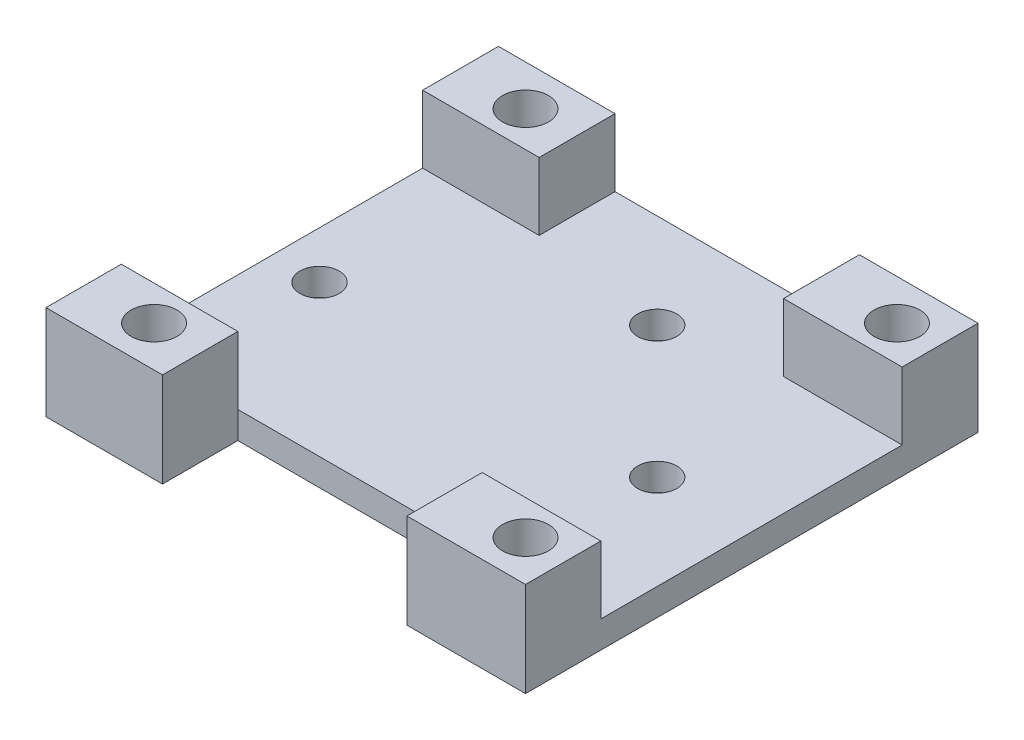
ISO-10303-21;
HEADER;
FILE_DESCRIPTION(('STEP AP214'),'2;1');
FILE_NAME('part.step','',(''),(''),'','','');
FILE_SCHEMA(('AUTOMOTIVE_DESIGN { 1 0 10303 214 1 1 1 1 }'));
ENDSEC;
DATA;
#1=APPLICATION_CONTEXT('core data for automotive mechanical design processes');
#2=APPLICATION_PROTOCOL_DEFINITION('international standard','automotive_design',2000,#1);
#3=PRODUCT_CONTEXT('',#1,'mechanical');
#4=PRODUCT('Part','Part','',(#3));
#5=PRODUCT_RELATED_PRODUCT_CATEGORY('part','',(#4));
#6=PRODUCT_DEFINITION_FORMATION('','',#4);
#7=PRODUCT_DEFINITION_CONTEXT('part definition',#1,'design');
#8=PRODUCT_DEFINITION('design','',#6,#7);
#9=PRODUCT_DEFINITION_SHAPE('','',#8);
#10=(LENGTH_UNIT() NAMED_UNIT(*) SI_UNIT(.MILLI.,.METRE.));
#11=(NAMED_UNIT(*) PLANE_ANGLE_UNIT() SI_UNIT($,.RADIAN.));
#12=(NAMED_UNIT(*) SI_UNIT($,.STERADIAN.) SOLID_ANGLE_UNIT());
#13=UNCERTAINTY_MEASURE_WITH_UNIT(LENGTH_MEASURE(1.E-05),#10,'distance_accuracy_value','');
#14=(GEOMETRIC_REPRESENTATION_CONTEXT(3) GLOBAL_UNCERTAINTY_ASSIGNED_CONTEXT((#13)) GLOBAL_UNIT_ASSIGNED_CONTEXT((#10,
#11,#12)) REPRESENTATION_CONTEXT('',''));
#15=CARTESIAN_POINT('',(0.,0.,0.));
#16=DIRECTION('',(0.,0.,1.));
#17=DIRECTION('',(1.,0.,0.));
#18=AXIS2_PLACEMENT_3D('',#15,#16,#17);
#19=CARTESIAN_POINT('',(0.,2.,0.));
#20=DIRECTION('',(0.,1.,0.));
#21=DIRECTION('',(0.,0.,1.));
#22=AXIS2_PLACEMENT_3D('',#19,#20,#21);
#23=PLANE('',#22);
#24=DIRECTION('',(0.,0.,-1.));
#25=VECTOR('',#24,1.);
#26=CARTESIAN_POINT('',(-15.5,2.,0.));
#27=LINE('',#26,#25);
#28=CARTESIAN_POINT('',(-15.5,2.,11.1762712747934));
#29=VERTEX_POINT('',#28);
#30=CARTESIAN_POINT('',(-15.5,2.,-11.1332856160443));
#31=VERTEX_POINT('',#30);
#32=EDGE_CURVE('E353',#29,#31,#27,.T.);
#33=ORIENTED_EDGE('',*,*,#32,.F.);
#34=DIRECTION('',(1.,0.,0.));
#35=VECTOR('',#34,1.);
#36=CARTESIAN_POINT('',(-20.,2.,11.1762712747934));
#37=LINE('',#36,#35);
#38=CARTESIAN_POINT('',(-6.87255590859099,2.,11.1762712747934));
#39=VERTEX_POINT('',#38);
#40=EDGE_CURVE('E207',#29,#39,#37,.T.);
#41=ORIENTED_EDGE('',*,*,#40,.T.);
#42=CARTESIAN_POINT('',(11.2192569335427,2.,11.1762712747934));
#43=VERTEX_POINT('',#42);
#44=EDGE_CURVE('E195',#39,#43,#37,.T.);
#45=ORIENTED_EDGE('',*,*,#44,.T.);
#46=CARTESIAN_POINT('',(20.,2.,11.1762712747934));
#47=VERTEX_POINT('',#46);
#48=EDGE_CURVE('E204',#43,#47,#37,.T.);
#49=ORIENTED_EDGE('',*,*,#48,.T.);
#50=DIRECTION('',(0.,0.,-1.));
#51=VECTOR('',#50,1.);
#52=CARTESIAN_POINT('',(20.,2.,-11.1332856160443));
#53=LINE('',#52,#51);
#54=CARTESIAN_POINT('',(20.,2.,-11.1332856160443));
#55=VERTEX_POINT('',#54);
#56=EDGE_CURVE('E259',#47,#55,#53,.T.);
#57=ORIENTED_EDGE('',*,*,#56,.T.);
#58=DIRECTION('',(-1.,0.,0.));
#59=VECTOR('',#58,1.);
#60=CARTESIAN_POINT('',(11.2192569335427,2.,-11.1332856160443));
#61=LINE('',#60,#59);
#62=CARTESIAN_POINT('',(11.2192569335427,2.,-11.1332856160443));
#63=VERTEX_POINT('',#62);
#64=EDGE_CURVE('E262',#55,#63,#61,.T.);
#65=ORIENTED_EDGE('',*,*,#64,.T.);
#66=DIRECTION('',(0.,0.,-1.));
#67=VECTOR('',#66,1.);
#68=CARTESIAN_POINT('',(11.2192569335427,2.,-16.75));
#69=LINE('',#68,#67);
#70=CARTESIAN_POINT('',(11.2192569335427,2.,-16.75));
#71=VERTEX_POINT('',#70);
#72=EDGE_CURVE('E209',#63,#71,#69,.T.);
#73=ORIENTED_EDGE('',*,*,#72,.T.);
#74=DIRECTION('',(-1.,0.,0.));
#75=VECTOR('',#74,1.);
#76=CARTESIAN_POINT('',(-20.,2.,-16.75));
#77=LINE('',#76,#75);
#78=CARTESIAN_POINT('',(-6.87255590859099,2.,-16.75));
#79=VERTEX_POINT('',#78);
#80=EDGE_CURVE('E216',#71,#79,#77,.T.);
#81=ORIENTED_EDGE('',*,*,#80,.T.);
#82=DIRECTION('',(0.,0.,-1.));
#83=VECTOR('',#82,1.);
#84=CARTESIAN_POINT('',(-6.87255590859099,2.,-16.75));
#85=LINE('',#84,#83);
#86=CARTESIAN_POINT('',(-6.87255590859099,2.,-11.1332856160443));
#87=VERTEX_POINT('',#86);
#88=EDGE_CURVE('E329',#87,#79,#85,.T.);
#89=ORIENTED_EDGE('',*,*,#88,.F.);
#90=DIRECTION('',(1.,0.,0.));
#91=VECTOR('',#90,1.);
#92=CARTESIAN_POINT('',(-6.87255590859099,2.,-11.1332856160443));
#93=LINE('',#92,#91);
#94=EDGE_CURVE('E326',#31,#87,#93,.T.);
#95=ORIENTED_EDGE('',*,*,#94,.F.);
#96=EDGE_LOOP('',(#33,#41,#45,#49,#57,#65,#73,#81,#89,#95));
#97=FACE_BOUND('',#96,.T.);
#98=CARTESIAN_POINT('',(3.25,2.,-9.75000000000001));
#99=DIRECTION('',(0.,1.,0.));
#100=DIRECTION('',(0.,0.,1.));
#101=AXIS2_PLACEMENT_3D('',#98,#99,#100);
#102=CIRCLE('',#101,1.44999999999999);
#103=CARTESIAN_POINT('',(3.25,2.,-8.30000000000002));
#104=VERTEX_POINT('',#103);
#105=EDGE_CURVE('E271',#104,#104,#102,.T.);
#106=ORIENTED_EDGE('',*,*,#105,.F.);
#107=EDGE_LOOP('',(#106));
#108=FACE_BOUND('',#107,.T.);
#109=CARTESIAN_POINT('',(13.,2.,0.));
#110=DIRECTION('',(0.,1.,0.));
#111=DIRECTION('',(0.,0.,1.));
#112=AXIS2_PLACEMENT_3D('',#109,#110,#111);
#113=CIRCLE('',#112,1.44999999999999);
#114=CARTESIAN_POINT('',(13.,2.,1.44999999999998));
#115=VERTEX_POINT('',#114);
#116=EDGE_CURVE('E280',#115,#115,#113,.T.);
#117=ORIENTED_EDGE('',*,*,#116,.F.);
#118=EDGE_LOOP('',(#117));
#119=FACE_BOUND('',#118,.T.);
#120=CARTESIAN_POINT('',(-12.,2.,0.));
#121=DIRECTION('',(0.,1.,0.));
#122=DIRECTION('',(0.,0.,1.));
#123=AXIS2_PLACEMENT_3D('',#120,#121,#122);
#124=CIRCLE('',#123,1.44999999999999);
#125=CARTESIAN_POINT('',(-12.,2.,1.44999999999998));
#126=VERTEX_POINT('',#125);
#127=EDGE_CURVE('E286',#126,#126,#124,.T.);
#128=ORIENTED_EDGE('',*,*,#127,.F.);
#129=EDGE_LOOP('',(#128));
#130=FACE_BOUND('',#129,.T.);
#131=ADVANCED_FACE('F36',(#97,#108,#119,#130),#23,.T.);
#132=CARTESIAN_POINT('',(0.,7.,0.));
#133=DIRECTION('',(0.,1.,0.));
#134=DIRECTION('',(0.,0.,1.));
#135=AXIS2_PLACEMENT_3D('',#132,#133,#134);
#136=PLANE('',#135);
#137=DIRECTION('',(-1.,0.,0.));
#138=VECTOR('',#137,1.);
#139=CARTESIAN_POINT('',(11.2192569335427,7.,-11.1332856160443));
#140=LINE('',#139,#138);
#141=CARTESIAN_POINT('',(20.,7.,-11.1332856160443));
#142=VERTEX_POINT('',#141);
#143=CARTESIAN_POINT('',(11.2192569335427,7.,-11.1332856160443));
#144=VERTEX_POINT('',#143);
#145=EDGE_CURVE('E257',#142,#144,#140,.T.);
#146=ORIENTED_EDGE('',*,*,#145,.F.);
#147=DIRECTION('',(0.,0.,-1.));
#148=VECTOR('',#147,1.);
#149=CARTESIAN_POINT('',(20.,7.,-16.75));
#150=LINE('',#149,#148);
#151=CARTESIAN_POINT('',(20.,7.,-16.75));
#152=VERTEX_POINT('',#151);
#153=EDGE_CURVE('E177',#142,#152,#150,.T.);
#154=ORIENTED_EDGE('',*,*,#153,.T.);
#155=DIRECTION('',(-1.,0.,0.));
#156=VECTOR('',#155,1.);
#157=CARTESIAN_POINT('',(-20.,7.,-16.75));
#158=LINE('',#157,#156);
#159=CARTESIAN_POINT('',(11.2192569335427,7.,-16.75));
#160=VERTEX_POINT('',#159);
#161=EDGE_CURVE('E180',#152,#160,#158,.T.);
#162=ORIENTED_EDGE('',*,*,#161,.T.);
#163=DIRECTION('',(0.,0.,-1.));
#164=VECTOR('',#163,1.);
#165=CARTESIAN_POINT('',(11.2192569335427,7.,-16.75));
#166=LINE('',#165,#164);
#167=EDGE_CURVE('E210',#144,#160,#166,.T.);
#168=ORIENTED_EDGE('',*,*,#167,.F.);
#169=EDGE_LOOP('',(#146,#154,#162,#168));
#170=FACE_BOUND('',#169,.T.);
#171=CARTESIAN_POINT('',(17.,7.,-13.75));
#172=DIRECTION('',(0.,1.,0.));
#173=DIRECTION('',(0.,0.,1.));
#174=AXIS2_PLACEMENT_3D('',#171,#172,#173);
#175=CIRCLE('',#174,1.69999999999999);
#176=CARTESIAN_POINT('',(17.,7.,-12.05));
#177=VERTEX_POINT('',#176);
#178=EDGE_CURVE('E232',#177,#177,#175,.T.);
#179=ORIENTED_EDGE('',*,*,#178,.F.);
#180=EDGE_LOOP('',(#179));
#181=FACE_BOUND('',#180,.T.);
#182=ADVANCED_FACE('F255',(#170,#181),#136,.T.);
#183=CARTESIAN_POINT('',(20.,7.,-16.75));
#184=DIRECTION('',(-1.,0.,0.));
#185=DIRECTION('',(0.,0.,1.));
#186=AXIS2_PLACEMENT_3D('',#183,#184,#185);
#187=PLANE('',#186);
#188=ORIENTED_EDGE('',*,*,#56,.F.);
#189=DIRECTION('',(0.,-1.,0.));
#190=VECTOR('',#189,1.);
#191=CARTESIAN_POINT('',(20.,7.,11.1762712747934));
#192=LINE('',#191,#190);
#193=CARTESIAN_POINT('',(20.,7.,11.1762712747934));
#194=VERTEX_POINT('',#193);
#195=EDGE_CURVE('E302',#194,#47,#192,.T.);
#196=ORIENTED_EDGE('',*,*,#195,.F.);
#197=DIRECTION('',(0.,0.,1.));
#198=VECTOR('',#197,1.);
#199=CARTESIAN_POINT('',(20.,7.,11.1762712747934));
#200=LINE('',#199,#198);
#201=CARTESIAN_POINT('',(20.,7.,16.75));
#202=VERTEX_POINT('',#201);
#203=EDGE_CURVE('E314',#194,#202,#200,.T.);
#204=ORIENTED_EDGE('',*,*,#203,.T.);
#205=DIRECTION('',(0.,-1.,0.));
#206=VECTOR('',#205,1.);
#207=CARTESIAN_POINT('',(20.,7.,16.75));
#208=LINE('',#207,#206);
#209=CARTESIAN_POINT('',(20.,0.,16.75));
#210=VERTEX_POINT('',#209);
#211=EDGE_CURVE('E245',#202,#210,#208,.T.);
#212=ORIENTED_EDGE('',*,*,#211,.T.);
#213=DIRECTION('',(0.,0.,-1.));
#214=VECTOR('',#213,1.);
#215=CARTESIAN_POINT('',(20.,0.,-16.75));
#216=LINE('',#215,#214);
#217=CARTESIAN_POINT('',(20.,0.,-16.75));
#218=VERTEX_POINT('',#217);
#219=EDGE_CURVE('E182',#210,#218,#216,.T.);
#220=ORIENTED_EDGE('',*,*,#219,.T.);
#221=DIRECTION('',(0.,-1.,0.));
#222=VECTOR('',#221,1.);
#223=CARTESIAN_POINT('',(20.,7.,-16.75));
#224=LINE('',#223,#222);
#225=EDGE_CURVE('E186',#152,#218,#224,.T.);
#226=ORIENTED_EDGE('',*,*,#225,.F.);
#227=ORIENTED_EDGE('',*,*,#153,.F.);
#228=DIRECTION('',(0.,1.,0.));
#229=VECTOR('',#228,1.);
#230=CARTESIAN_POINT('',(20.,2.,-11.1332856160443));
#231=LINE('',#230,#229);
#232=EDGE_CURVE('E213',#55,#142,#231,.T.);
#233=ORIENTED_EDGE('',*,*,#232,.F.);
#234=EDGE_LOOP('',(#188,#196,#204,#212,#220,#226,#227,#233));
#235=FACE_BOUND('',#234,.T.);
#236=ADVANCED_FACE('F38',(#235),#187,.F.);
#237=CARTESIAN_POINT('',(-20.,7.,-16.75));
#238=DIRECTION('',(0.,0.,1.));
#239=DIRECTION('',(1.,0.,0.));
#240=AXIS2_PLACEMENT_3D('',#237,#238,#239);
#241=PLANE('',#240);
#242=DIRECTION('',(-1.,0.,0.));
#243=VECTOR('',#242,1.);
#244=CARTESIAN_POINT('',(-20.,0.,-16.75));
#245=LINE('',#244,#243);
#246=CARTESIAN_POINT('',(-15.5,0.,-16.75));
#247=VERTEX_POINT('',#246);
#248=EDGE_CURVE('E178',#218,#247,#245,.T.);
#249=ORIENTED_EDGE('',*,*,#248,.T.);
#250=DIRECTION('',(0.,1.,0.));
#251=VECTOR('',#250,1.);
#252=CARTESIAN_POINT('',(-15.5,0.,-16.75));
#253=LINE('',#252,#251);
#254=CARTESIAN_POINT('',(-15.5,7.,-16.75));
#255=VERTEX_POINT('',#254);
#256=EDGE_CURVE('E159',#247,#255,#253,.T.);
#257=ORIENTED_EDGE('',*,*,#256,.T.);
#258=DIRECTION('',(-1.,0.,0.));
#259=VECTOR('',#258,1.);
#260=CARTESIAN_POINT('',(-6.87255590859099,7.,-16.75));
#261=LINE('',#260,#259);
#262=CARTESIAN_POINT('',(-6.87255590859099,7.,-16.75));
#263=VERTEX_POINT('',#262);
#264=EDGE_CURVE('E334',#263,#255,#261,.T.);
#265=ORIENTED_EDGE('',*,*,#264,.F.);
#266=DIRECTION('',(0.,-1.,0.));
#267=VECTOR('',#266,1.);
#268=CARTESIAN_POINT('',(-6.87255590859099,7.,-16.75));
#269=LINE('',#268,#267);
#270=EDGE_CURVE('E311',#263,#79,#269,.T.);
#271=ORIENTED_EDGE('',*,*,#270,.T.);
#272=ORIENTED_EDGE('',*,*,#80,.F.);
#273=DIRECTION('',(0.,1.,0.));
#274=VECTOR('',#273,1.);
#275=CARTESIAN_POINT('',(11.2192569335427,2.,-16.75));
#276=LINE('',#275,#274);
#277=EDGE_CURVE('E219',#71,#160,#276,.T.);
#278=ORIENTED_EDGE('',*,*,#277,.T.);
#279=ORIENTED_EDGE('',*,*,#161,.F.);
#280=ORIENTED_EDGE('',*,*,#225,.T.);
#281=EDGE_LOOP('',(#249,#257,#265,#271,#272,#278,#279,#280));
#282=FACE_BOUND('',#281,.T.);
#283=ADVANCED_FACE('F249',(#282),#241,.F.);
#284=CARTESIAN_POINT('',(-20.,7.,16.75));
#285=DIRECTION('',(0.,0.,-1.));
#286=DIRECTION('',(-1.,0.,0.));
#287=AXIS2_PLACEMENT_3D('',#284,#285,#286);
#288=PLANE('',#287);
#289=DIRECTION('',(1.,0.,0.));
#290=VECTOR('',#289,1.);
#291=CARTESIAN_POINT('',(-20.,7.,16.75));
#292=LINE('',#291,#290);
#293=CARTESIAN_POINT('',(-15.5,7.,16.75));
#294=VERTEX_POINT('',#293);
#295=CARTESIAN_POINT('',(-6.87255590859099,7.,16.75));
#296=VERTEX_POINT('',#295);
#297=EDGE_CURVE('E171',#294,#296,#292,.T.);
#298=ORIENTED_EDGE('',*,*,#297,.F.);
#299=DIRECTION('',(0.,1.,0.));
#300=VECTOR('',#299,1.);
#301=CARTESIAN_POINT('',(-15.5,0.,16.75));
#302=LINE('',#301,#300);
#303=CARTESIAN_POINT('',(-15.5,0.,16.75));
#304=VERTEX_POINT('',#303);
#305=EDGE_CURVE('E156',#304,#294,#302,.T.);
#306=ORIENTED_EDGE('',*,*,#305,.F.);
#307=DIRECTION('',(1.,0.,0.));
#308=VECTOR('',#307,1.);
#309=CARTESIAN_POINT('',(-20.,0.,16.75));
#310=LINE('',#309,#308);
#311=CARTESIAN_POINT('',(-6.87255590859099,0.,16.75));
#312=VERTEX_POINT('',#311);
#313=EDGE_CURVE('E169',#304,#312,#310,.T.);
#314=ORIENTED_EDGE('',*,*,#313,.T.);
#315=DIRECTION('',(0.,1.,0.));
#316=VECTOR('',#315,1.);
#317=CARTESIAN_POINT('',(-6.87255590859099,0.,16.75));
#318=LINE('',#317,#316);
#319=EDGE_CURVE('E290',#312,#296,#318,.T.);
#320=ORIENTED_EDGE('',*,*,#319,.T.);
#321=EDGE_LOOP('',(#298,#306,#314,#320));
#322=FACE_BOUND('',#321,.T.);
#323=ADVANCED_FACE('F167',(#322),#288,.F.);
#324=DIRECTION('',(0.,0.,-1.));
#325=VECTOR('',#324,1.);
#326=CARTESIAN_POINT('',(-15.5,7.,-16.75));
#327=LINE('',#326,#325);
#328=CARTESIAN_POINT('',(-15.5,7.,11.1762712747934));
#329=VERTEX_POINT('',#328);
#330=EDGE_CURVE('E163',#294,#329,#327,.T.);
#331=ORIENTED_EDGE('',*,*,#330,.F.);
#332=ORIENTED_EDGE('',*,*,#297,.T.);
#333=DIRECTION('',(0.,0.,1.));
#334=VECTOR('',#333,1.);
#335=CARTESIAN_POINT('',(-6.87255590859099,7.,11.1762712747934));
#336=LINE('',#335,#334);
#337=CARTESIAN_POINT('',(-6.87255590859099,7.,11.1762712747934));
#338=VERTEX_POINT('',#337);
#339=EDGE_CURVE('E294',#338,#296,#336,.T.);
#340=ORIENTED_EDGE('',*,*,#339,.F.);
#341=DIRECTION('',(1.,0.,0.));
#342=VECTOR('',#341,1.);
#343=CARTESIAN_POINT('',(-20.,7.,11.1762712747934));
#344=LINE('',#343,#342);
#345=EDGE_CURVE('E220',#329,#338,#344,.T.);
#346=ORIENTED_EDGE('',*,*,#345,.F.);
#347=EDGE_LOOP('',(#331,#332,#340,#346));
#348=FACE_BOUND('',#347,.T.);
#349=CARTESIAN_POINT('',(-10.5,7.,13.75));
#350=DIRECTION('',(0.,1.,0.));
#351=DIRECTION('',(0.,0.,1.));
#352=AXIS2_PLACEMENT_3D('',#349,#350,#351);
#353=CIRCLE('',#352,1.69999999999999);
#354=CARTESIAN_POINT('',(-10.5,7.,15.45));
#355=VERTEX_POINT('',#354);
#356=EDGE_CURVE('E226',#355,#355,#353,.T.);
#357=ORIENTED_EDGE('',*,*,#356,.F.);
#358=EDGE_LOOP('',(#357));
#359=FACE_BOUND('',#358,.T.);
#360=ADVANCED_FACE('F364',(#348,#359),#136,.T.);
#361=CARTESIAN_POINT('',(0.,0.,0.));
#362=DIRECTION('',(0.,1.,0.));
#363=DIRECTION('',(0.,0.,1.));
#364=AXIS2_PLACEMENT_3D('',#361,#362,#363);
#365=PLANE('',#364);
#366=CARTESIAN_POINT('',(-10.5,0.,-13.75));
#367=DIRECTION('',(0.,1.,0.));
#368=DIRECTION('',(0.,0.,1.));
#369=AXIS2_PLACEMENT_3D('',#366,#367,#368);
#370=CIRCLE('',#369,1.69999999999999);
#371=CARTESIAN_POINT('',(-10.5,0.,-12.05));
#372=VERTEX_POINT('',#371);
#373=EDGE_CURVE('E344',#372,#372,#370,.T.);
#374=ORIENTED_EDGE('',*,*,#373,.T.);
#375=EDGE_LOOP('',(#374));
#376=FACE_BOUND('',#375,.T.);
#377=CARTESIAN_POINT('',(17.,0.,13.75));
#378=DIRECTION('',(0.,1.,0.));
#379=DIRECTION('',(0.,0.,1.));
#380=AXIS2_PLACEMENT_3D('',#377,#378,#379);
#381=CIRCLE('',#380,1.69999999999999);
#382=CARTESIAN_POINT('',(17.,0.,15.45));
#383=VERTEX_POINT('',#382);
#384=EDGE_CURVE('E332',#383,#383,#381,.T.);
#385=ORIENTED_EDGE('',*,*,#384,.T.);
#386=EDGE_LOOP('',(#385));
#387=FACE_BOUND('',#386,.T.);
#388=CARTESIAN_POINT('',(-12.,0.,0.));
#389=DIRECTION('',(0.,1.,0.));
#390=DIRECTION('',(0.,0.,1.));
#391=AXIS2_PLACEMENT_3D('',#388,#389,#390);
#392=CIRCLE('',#391,1.45);
#393=CARTESIAN_POINT('',(-12.,0.,1.44999999999999));
#394=VERTEX_POINT('',#393);
#395=EDGE_CURVE('E283',#394,#394,#392,.T.);
#396=ORIENTED_EDGE('',*,*,#395,.T.);
#397=EDGE_LOOP('',(#396));
#398=FACE_BOUND('',#397,.T.);
#399=CARTESIAN_POINT('',(13.,0.,0.));
#400=DIRECTION('',(0.,1.,0.));
#401=DIRECTION('',(0.,0.,1.));
#402=AXIS2_PLACEMENT_3D('',#399,#400,#401);
#403=CIRCLE('',#402,1.45);
#404=CARTESIAN_POINT('',(13.,0.,1.44999999999999));
#405=VERTEX_POINT('',#404);
#406=EDGE_CURVE('E275',#405,#405,#403,.T.);
#407=ORIENTED_EDGE('',*,*,#406,.T.);
#408=EDGE_LOOP('',(#407));
#409=FACE_BOUND('',#408,.T.);
#410=CARTESIAN_POINT('',(3.25,0.,-9.75000000000001));
#411=DIRECTION('',(0.,1.,0.));
#412=DIRECTION('',(0.,0.,1.));
#413=AXIS2_PLACEMENT_3D('',#410,#411,#412);
#414=CIRCLE('',#413,1.45);
#415=CARTESIAN_POINT('',(3.25,0.,-8.30000000000001));
#416=VERTEX_POINT('',#415);
#417=EDGE_CURVE('E269',#416,#416,#414,.T.);
#418=ORIENTED_EDGE('',*,*,#417,.T.);
#419=EDGE_LOOP('',(#418));
#420=FACE_BOUND('',#419,.T.);
#421=CARTESIAN_POINT('',(-10.5,0.,13.75));
#422=DIRECTION('',(0.,1.,0.));
#423=DIRECTION('',(0.,0.,1.));
#424=AXIS2_PLACEMENT_3D('',#421,#422,#423);
#425=CIRCLE('',#424,1.69999999999999);
#426=CARTESIAN_POINT('',(-10.5,0.,15.45));
#427=VERTEX_POINT('',#426);
#428=EDGE_CURVE('E229',#427,#427,#425,.T.);
#429=ORIENTED_EDGE('',*,*,#428,.T.);
#430=EDGE_LOOP('',(#429));
#431=FACE_BOUND('',#430,.T.);
#432=CARTESIAN_POINT('',(17.,0.,-13.75));
#433=DIRECTION('',(0.,1.,0.));
#434=DIRECTION('',(0.,0.,1.));
#435=AXIS2_PLACEMENT_3D('',#432,#433,#434);
#436=CIRCLE('',#435,1.7);
#437=CARTESIAN_POINT('',(17.,0.,-12.05));
#438=VERTEX_POINT('',#437);
#439=EDGE_CURVE('E235',#438,#438,#436,.T.);
#440=ORIENTED_EDGE('',*,*,#439,.T.);
#441=EDGE_LOOP('',(#440));
#442=FACE_BOUND('',#441,.T.);
#443=ORIENTED_EDGE('',*,*,#313,.F.);
#444=DIRECTION('',(0.,0.,-1.));
#445=VECTOR('',#444,1.);
#446=CARTESIAN_POINT('',(-15.5,0.,-16.75));
#447=LINE('',#446,#445);
#448=EDGE_CURVE('E153',#304,#247,#447,.T.);
#449=ORIENTED_EDGE('',*,*,#448,.T.);
#450=ORIENTED_EDGE('',*,*,#248,.F.);
#451=ORIENTED_EDGE('',*,*,#219,.F.);
#452=DIRECTION('',(-1.,0.,0.));
#453=VECTOR('',#452,1.);
#454=CARTESIAN_POINT('',(11.2192569335427,0.,16.75));
#455=LINE('',#454,#453);
#456=CARTESIAN_POINT('',(11.2192569335427,0.,16.75));
#457=VERTEX_POINT('',#456);
#458=EDGE_CURVE('E307',#210,#457,#455,.T.);
#459=ORIENTED_EDGE('',*,*,#458,.T.);
#460=DIRECTION('',(0.,0.,-1.));
#461=VECTOR('',#460,1.);
#462=CARTESIAN_POINT('',(11.2192569335427,0.,11.1762712747934));
#463=LINE('',#462,#461);
#464=CARTESIAN_POINT('',(11.2192569335427,0.,11.1762712747934));
#465=VERTEX_POINT('',#464);
#466=EDGE_CURVE('E58',#457,#465,#463,.T.);
#467=ORIENTED_EDGE('',*,*,#466,.T.);
#468=DIRECTION('',(-1.,0.,0.));
#469=VECTOR('',#468,1.);
#470=CARTESIAN_POINT('',(-6.87255590859099,0.,11.1762712747934));
#471=LINE('',#470,#469);
#472=CARTESIAN_POINT('',(-6.87255590859099,0.,11.1762712747934));
#473=VERTEX_POINT('',#472);
#474=EDGE_CURVE('E197',#465,#473,#471,.T.);
#475=ORIENTED_EDGE('',*,*,#474,.T.);
#476=DIRECTION('',(0.,0.,1.));
#477=VECTOR('',#476,1.);
#478=CARTESIAN_POINT('',(-6.87255590859099,0.,11.1762712747934));
#479=LINE('',#478,#477);
#480=EDGE_CURVE('E176',#473,#312,#479,.T.);
#481=ORIENTED_EDGE('',*,*,#480,.T.);
#482=EDGE_LOOP('',(#443,#449,#450,#451,#459,#467,#475,#481));
#483=FACE_BOUND('',#482,.T.);
#484=ADVANCED_FACE('F174',(#376,#387,#398,#409,#420,#431,#442,#483),#365,.F.);
#485=CARTESIAN_POINT('',(17.,7.,-13.75));
#486=DIRECTION('',(0.,1.,0.));
#487=DIRECTION('',(0.,0.,1.));
#488=AXIS2_PLACEMENT_3D('',#485,#486,#487);
#489=CYLINDRICAL_SURFACE('',#488,1.69999999999999);
#490=ORIENTED_EDGE('',*,*,#439,.F.);
#491=EDGE_LOOP('',(#490));
#492=FACE_BOUND('',#491,.T.);
#493=ORIENTED_EDGE('',*,*,#178,.T.);
#494=EDGE_LOOP('',(#493));
#495=FACE_BOUND('',#494,.T.);
#496=ADVANCED_FACE('F399',(#492,#495),#489,.F.);
#497=CARTESIAN_POINT('',(-10.5,7.,13.75));
#498=DIRECTION('',(0.,1.,0.));
#499=DIRECTION('',(0.,0.,1.));
#500=AXIS2_PLACEMENT_3D('',#497,#498,#499);
#501=CYLINDRICAL_SURFACE('',#500,1.69999999999999);
#502=ORIENTED_EDGE('',*,*,#428,.F.);
#503=EDGE_LOOP('',(#502));
#504=FACE_BOUND('',#503,.T.);
#505=ORIENTED_EDGE('',*,*,#356,.T.);
#506=EDGE_LOOP('',(#505));
#507=FACE_BOUND('',#506,.T.);
#508=ADVANCED_FACE('F393',(#504,#507),#501,.F.);
#509=CARTESIAN_POINT('',(11.2192569335427,2.,-16.75));
#510=DIRECTION('',(1.,0.,0.));
#511=DIRECTION('',(0.,0.,-1.));
#512=AXIS2_PLACEMENT_3D('',#509,#510,#511);
#513=PLANE('',#512);
#514=ORIENTED_EDGE('',*,*,#72,.F.);
#515=DIRECTION('',(0.,1.,0.));
#516=VECTOR('',#515,1.);
#517=CARTESIAN_POINT('',(11.2192569335427,2.,-11.1332856160443));
#518=LINE('',#517,#516);
#519=EDGE_CURVE('E222',#63,#144,#518,.T.);
#520=ORIENTED_EDGE('',*,*,#519,.T.);
#521=ORIENTED_EDGE('',*,*,#167,.T.);
#522=ORIENTED_EDGE('',*,*,#277,.F.);
#523=EDGE_LOOP('',(#514,#520,#521,#522));
#524=FACE_BOUND('',#523,.T.);
#525=ADVANCED_FACE('F390',(#524),#513,.F.);
#526=CARTESIAN_POINT('',(-20.,2.,11.1762712747934));
#527=DIRECTION('',(0.,0.,1.));
#528=DIRECTION('',(1.,0.,0.));
#529=AXIS2_PLACEMENT_3D('',#526,#527,#528);
#530=PLANE('',#529);
#531=ORIENTED_EDGE('',*,*,#40,.F.);
#532=DIRECTION('',(0.,1.,0.));
#533=VECTOR('',#532,1.);
#534=CARTESIAN_POINT('',(-15.5,2.,11.1762712747934));
#535=LINE('',#534,#533);
#536=EDGE_CURVE('E350',#29,#329,#535,.T.);
#537=ORIENTED_EDGE('',*,*,#536,.T.);
#538=ORIENTED_EDGE('',*,*,#345,.T.);
#539=DIRECTION('',(0.,1.,0.));
#540=VECTOR('',#539,1.);
#541=CARTESIAN_POINT('',(-6.87255590859099,0.,11.1762712747934));
#542=LINE('',#541,#540);
#543=EDGE_CURVE('E292',#39,#338,#542,.T.);
#544=ORIENTED_EDGE('',*,*,#543,.F.);
#545=EDGE_LOOP('',(#531,#537,#538,#544));
#546=FACE_BOUND('',#545,.T.);
#547=ADVANCED_FACE('F360',(#546),#530,.F.);
#548=CARTESIAN_POINT('',(11.2192569335427,2.,-11.1332856160443));
#549=DIRECTION('',(0.,0.,-1.));
#550=DIRECTION('',(-1.,0.,0.));
#551=AXIS2_PLACEMENT_3D('',#548,#549,#550);
#552=PLANE('',#551);
#553=ORIENTED_EDGE('',*,*,#145,.T.);
#554=ORIENTED_EDGE('',*,*,#519,.F.);
#555=ORIENTED_EDGE('',*,*,#64,.F.);
#556=ORIENTED_EDGE('',*,*,#232,.T.);
#557=EDGE_LOOP('',(#553,#554,#555,#556));
#558=FACE_BOUND('',#557,.T.);
#559=ADVANCED_FACE('F388',(#558),#552,.F.);
#560=CARTESIAN_POINT('',(3.25,2.,-9.75000000000001));
#561=DIRECTION('',(0.,1.,0.));
#562=DIRECTION('',(0.,0.,1.));
#563=AXIS2_PLACEMENT_3D('',#560,#561,#562);
#564=CYLINDRICAL_SURFACE('',#563,1.44999999999999);
#565=ORIENTED_EDGE('',*,*,#417,.F.);
#566=EDGE_LOOP('',(#565));
#567=FACE_BOUND('',#566,.T.);
#568=ORIENTED_EDGE('',*,*,#105,.T.);
#569=EDGE_LOOP('',(#568));
#570=FACE_BOUND('',#569,.T.);
#571=ADVANCED_FACE('F442',(#567,#570),#564,.F.);
#572=CARTESIAN_POINT('',(13.,2.,0.));
#573=DIRECTION('',(0.,1.,0.));
#574=DIRECTION('',(0.,0.,1.));
#575=AXIS2_PLACEMENT_3D('',#572,#573,#574);
#576=CYLINDRICAL_SURFACE('',#575,1.44999999999999);
#577=ORIENTED_EDGE('',*,*,#406,.F.);
#578=EDGE_LOOP('',(#577));
#579=FACE_BOUND('',#578,.T.);
#580=ORIENTED_EDGE('',*,*,#116,.T.);
#581=EDGE_LOOP('',(#580));
#582=FACE_BOUND('',#581,.T.);
#583=ADVANCED_FACE('F377',(#579,#582),#576,.F.);
#584=CARTESIAN_POINT('',(-12.,2.,0.));
#585=DIRECTION('',(0.,1.,0.));
#586=DIRECTION('',(0.,0.,1.));
#587=AXIS2_PLACEMENT_3D('',#584,#585,#586);
#588=CYLINDRICAL_SURFACE('',#587,1.44999999999999);
#589=ORIENTED_EDGE('',*,*,#395,.F.);
#590=EDGE_LOOP('',(#589));
#591=FACE_BOUND('',#590,.T.);
#592=ORIENTED_EDGE('',*,*,#127,.T.);
#593=EDGE_LOOP('',(#592));
#594=FACE_BOUND('',#593,.T.);
#595=ADVANCED_FACE('F369',(#591,#594),#588,.F.);
#596=CARTESIAN_POINT('',(-6.87255590859099,0.,11.1762712747934));
#597=DIRECTION('',(-1.,0.,0.));
#598=DIRECTION('',(0.,0.,1.));
#599=AXIS2_PLACEMENT_3D('',#596,#597,#598);
#600=PLANE('',#599);
#601=ORIENTED_EDGE('',*,*,#339,.T.);
#602=ORIENTED_EDGE('',*,*,#319,.F.);
#603=ORIENTED_EDGE('',*,*,#480,.F.);
#604=EDGE_CURVE('E289',#473,#39,#542,.T.);
#605=ORIENTED_EDGE('',*,*,#604,.T.);
#606=ORIENTED_EDGE('',*,*,#543,.T.);
#607=EDGE_LOOP('',(#601,#602,#603,#605,#606));
#608=FACE_BOUND('',#607,.T.);
#609=ADVANCED_FACE('F367',(#608),#600,.F.);
#610=CARTESIAN_POINT('',(-6.87255590859099,0.,11.1762712747934));
#611=DIRECTION('',(0.,0.,-1.));
#612=DIRECTION('',(-1.,0.,0.));
#613=AXIS2_PLACEMENT_3D('',#610,#611,#612);
#614=PLANE('',#613);
#615=ORIENTED_EDGE('',*,*,#474,.F.);
#616=DIRECTION('',(0.,1.,0.));
#617=VECTOR('',#616,1.);
#618=CARTESIAN_POINT('',(11.2192569335427,0.,11.1762712747934));
#619=LINE('',#618,#617);
#620=EDGE_CURVE('E44',#465,#43,#619,.T.);
#621=ORIENTED_EDGE('',*,*,#620,.T.);
#622=ORIENTED_EDGE('',*,*,#44,.F.);
#623=ORIENTED_EDGE('',*,*,#604,.F.);
#624=EDGE_LOOP('',(#615,#621,#622,#623));
#625=FACE_BOUND('',#624,.T.);
#626=ADVANCED_FACE('F193',(#625),#614,.F.);
#627=CARTESIAN_POINT('',(11.2192569335427,7.,11.1762712747934));
#628=DIRECTION('',(-1.,0.,0.));
#629=DIRECTION('',(0.,0.,1.));
#630=AXIS2_PLACEMENT_3D('',#627,#628,#629);
#631=PLANE('',#630);
#632=ORIENTED_EDGE('',*,*,#466,.F.);
#633=DIRECTION('',(0.,-1.,0.));
#634=VECTOR('',#633,1.);
#635=CARTESIAN_POINT('',(11.2192569335427,7.,16.75));
#636=LINE('',#635,#634);
#637=CARTESIAN_POINT('',(11.2192569335427,7.,16.75));
#638=VERTEX_POINT('',#637);
#639=EDGE_CURVE('E297',#638,#457,#636,.T.);
#640=ORIENTED_EDGE('',*,*,#639,.F.);
#641=DIRECTION('',(0.,0.,-1.));
#642=VECTOR('',#641,1.);
#643=CARTESIAN_POINT('',(11.2192569335427,7.,11.1762712747934));
#644=LINE('',#643,#642);
#645=CARTESIAN_POINT('',(11.2192569335427,7.,11.1762712747934));
#646=VERTEX_POINT('',#645);
#647=EDGE_CURVE('E309',#638,#646,#644,.T.);
#648=ORIENTED_EDGE('',*,*,#647,.T.);
#649=DIRECTION('',(0.,-1.,0.));
#650=VECTOR('',#649,1.);
#651=CARTESIAN_POINT('',(11.2192569335427,7.,11.1762712747934));
#652=LINE('',#651,#650);
#653=EDGE_CURVE('E300',#646,#43,#652,.T.);
#654=ORIENTED_EDGE('',*,*,#653,.T.);
#655=ORIENTED_EDGE('',*,*,#620,.F.);
#656=EDGE_LOOP('',(#632,#640,#648,#654,#655));
#657=FACE_BOUND('',#656,.T.);
#658=ADVANCED_FACE('F375',(#657),#631,.T.);
#659=CARTESIAN_POINT('',(11.2192569335427,7.,16.75));
#660=DIRECTION('',(0.,0.,1.));
#661=DIRECTION('',(1.,0.,0.));
#662=AXIS2_PLACEMENT_3D('',#659,#660,#661);
#663=PLANE('',#662);
#664=ORIENTED_EDGE('',*,*,#458,.F.);
#665=ORIENTED_EDGE('',*,*,#211,.F.);
#666=DIRECTION('',(-1.,0.,0.));
#667=VECTOR('',#666,1.);
#668=CARTESIAN_POINT('',(11.2192569335427,7.,16.75));
#669=LINE('',#668,#667);
#670=EDGE_CURVE('E303',#202,#638,#669,.T.);
#671=ORIENTED_EDGE('',*,*,#670,.T.);
#672=ORIENTED_EDGE('',*,*,#639,.T.);
#673=EDGE_LOOP('',(#664,#665,#671,#672));
#674=FACE_BOUND('',#673,.T.);
#675=ADVANCED_FACE('F500',(#674),#663,.T.);
#676=CARTESIAN_POINT('',(11.2192569335427,7.,11.1762712747934));
#677=DIRECTION('',(0.,0.,-1.));
#678=DIRECTION('',(-1.,0.,0.));
#679=AXIS2_PLACEMENT_3D('',#676,#677,#678);
#680=PLANE('',#679);
#681=ORIENTED_EDGE('',*,*,#195,.T.);
#682=ORIENTED_EDGE('',*,*,#48,.F.);
#683=ORIENTED_EDGE('',*,*,#653,.F.);
#684=DIRECTION('',(1.,0.,0.));
#685=VECTOR('',#684,1.);
#686=CARTESIAN_POINT('',(11.2192569335427,7.,11.1762712747934));
#687=LINE('',#686,#685);
#688=EDGE_CURVE('E316',#646,#194,#687,.T.);
#689=ORIENTED_EDGE('',*,*,#688,.T.);
#690=EDGE_LOOP('',(#681,#682,#683,#689));
#691=FACE_BOUND('',#690,.T.);
#692=ADVANCED_FACE('F508',(#691),#680,.T.);
#693=CARTESIAN_POINT('',(0.,7.,0.));
#694=DIRECTION('',(0.,1.,0.));
#695=DIRECTION('',(0.,0.,1.));
#696=AXIS2_PLACEMENT_3D('',#693,#694,#695);
#697=PLANE('',#696);
#698=CARTESIAN_POINT('',(17.,7.,13.75));
#699=DIRECTION('',(0.,1.,0.));
#700=DIRECTION('',(0.,0.,1.));
#701=AXIS2_PLACEMENT_3D('',#698,#699,#700);
#702=CIRCLE('',#701,1.69999999999999);
#703=CARTESIAN_POINT('',(17.,7.,15.45));
#704=VERTEX_POINT('',#703);
#705=EDGE_CURVE('E341',#704,#704,#702,.T.);
#706=ORIENTED_EDGE('',*,*,#705,.F.);
#707=EDGE_LOOP('',(#706));
#708=FACE_BOUND('',#707,.T.);
#709=ORIENTED_EDGE('',*,*,#647,.F.);
#710=ORIENTED_EDGE('',*,*,#670,.F.);
#711=ORIENTED_EDGE('',*,*,#203,.F.);
#712=ORIENTED_EDGE('',*,*,#688,.F.);
#713=EDGE_LOOP('',(#709,#710,#711,#712));
#714=FACE_BOUND('',#713,.T.);
#715=ADVANCED_FACE('F517',(#708,#714),#697,.T.);
#716=CARTESIAN_POINT('',(-6.87255590859099,7.,-16.75));
#717=DIRECTION('',(-1.,0.,0.));
#718=DIRECTION('',(0.,0.,1.));
#719=AXIS2_PLACEMENT_3D('',#716,#717,#718);
#720=PLANE('',#719);
#721=ORIENTED_EDGE('',*,*,#88,.T.);
#722=ORIENTED_EDGE('',*,*,#270,.F.);
#723=DIRECTION('',(0.,0.,-1.));
#724=VECTOR('',#723,1.);
#725=CARTESIAN_POINT('',(-6.87255590859099,7.,-16.75));
#726=LINE('',#725,#724);
#727=CARTESIAN_POINT('',(-6.87255590859099,7.,-11.1332856160443));
#728=VERTEX_POINT('',#727);
#729=EDGE_CURVE('E328',#728,#263,#726,.T.);
#730=ORIENTED_EDGE('',*,*,#729,.F.);
#731=DIRECTION('',(0.,-1.,0.));
#732=VECTOR('',#731,1.);
#733=CARTESIAN_POINT('',(-6.87255590859099,7.,-11.1332856160443));
#734=LINE('',#733,#732);
#735=EDGE_CURVE('E322',#728,#87,#734,.T.);
#736=ORIENTED_EDGE('',*,*,#735,.T.);
#737=EDGE_LOOP('',(#721,#722,#730,#736));
#738=FACE_BOUND('',#737,.T.);
#739=ADVANCED_FACE('F527',(#738),#720,.F.);
#740=CARTESIAN_POINT('',(-6.87255590859099,7.,-11.1332856160443));
#741=DIRECTION('',(0.,0.,-1.));
#742=DIRECTION('',(-1.,0.,0.));
#743=AXIS2_PLACEMENT_3D('',#740,#741,#742);
#744=PLANE('',#743);
#745=DIRECTION('',(1.,0.,0.));
#746=VECTOR('',#745,1.);
#747=CARTESIAN_POINT('',(-6.87255590859099,7.,-11.1332856160443));
#748=LINE('',#747,#746);
#749=CARTESIAN_POINT('',(-15.5,7.,-11.1332856160443));
#750=VERTEX_POINT('',#749);
#751=EDGE_CURVE('E325',#750,#728,#748,.T.);
#752=ORIENTED_EDGE('',*,*,#751,.F.);
#753=DIRECTION('',(0.,-1.,0.));
#754=VECTOR('',#753,1.);
#755=CARTESIAN_POINT('',(-15.5,7.,-11.1332856160443));
#756=LINE('',#755,#754);
#757=EDGE_CURVE('E51',#750,#31,#756,.T.);
#758=ORIENTED_EDGE('',*,*,#757,.T.);
#759=ORIENTED_EDGE('',*,*,#94,.T.);
#760=ORIENTED_EDGE('',*,*,#735,.F.);
#761=EDGE_LOOP('',(#752,#758,#759,#760));
#762=FACE_BOUND('',#761,.T.);
#763=ADVANCED_FACE('F552',(#762),#744,.F.);
#764=CARTESIAN_POINT('',(0.,7.,0.));
#765=DIRECTION('',(0.,-1.,0.));
#766=DIRECTION('',(0.,0.,-1.));
#767=AXIS2_PLACEMENT_3D('',#764,#765,#766);
#768=PLANE('',#767);
#769=CARTESIAN_POINT('',(-10.5,7.,-13.75));
#770=DIRECTION('',(0.,1.,0.));
#771=DIRECTION('',(0.,0.,1.));
#772=AXIS2_PLACEMENT_3D('',#769,#770,#771);
#773=CIRCLE('',#772,1.69999999999999);
#774=CARTESIAN_POINT('',(-10.5,7.,-12.05));
#775=VERTEX_POINT('',#774);
#776=EDGE_CURVE('E347',#775,#775,#773,.T.);
#777=ORIENTED_EDGE('',*,*,#776,.F.);
#778=EDGE_LOOP('',(#777));
#779=FACE_BOUND('',#778,.T.);
#780=ORIENTED_EDGE('',*,*,#264,.T.);
#781=DIRECTION('',(0.,0.,1.));
#782=VECTOR('',#781,1.);
#783=CARTESIAN_POINT('',(-15.5,7.,0.));
#784=LINE('',#783,#782);
#785=EDGE_CURVE('E11',#255,#750,#784,.T.);
#786=ORIENTED_EDGE('',*,*,#785,.T.);
#787=ORIENTED_EDGE('',*,*,#751,.T.);
#788=ORIENTED_EDGE('',*,*,#729,.T.);
#789=EDGE_LOOP('',(#780,#786,#787,#788));
#790=FACE_BOUND('',#789,.T.);
#791=ADVANCED_FACE('F561',(#779,#790),#768,.F.);
#792=CARTESIAN_POINT('',(17.,7.,13.75));
#793=DIRECTION('',(0.,1.,0.));
#794=DIRECTION('',(0.,0.,1.));
#795=AXIS2_PLACEMENT_3D('',#792,#793,#794);
#796=CYLINDRICAL_SURFACE('',#795,1.69999999999999);
#797=ORIENTED_EDGE('',*,*,#384,.F.);
#798=EDGE_LOOP('',(#797));
#799=FACE_BOUND('',#798,.T.);
#800=ORIENTED_EDGE('',*,*,#705,.T.);
#801=EDGE_LOOP('',(#800));
#802=FACE_BOUND('',#801,.T.);
#803=ADVANCED_FACE('F570',(#799,#802),#796,.F.);
#804=CARTESIAN_POINT('',(-10.5,7.,-13.75));
#805=DIRECTION('',(0.,1.,0.));
#806=DIRECTION('',(0.,0.,1.));
#807=AXIS2_PLACEMENT_3D('',#804,#805,#806);
#808=CYLINDRICAL_SURFACE('',#807,1.69999999999999);
#809=ORIENTED_EDGE('',*,*,#373,.F.);
#810=EDGE_LOOP('',(#809));
#811=FACE_BOUND('',#810,.T.);
#812=ORIENTED_EDGE('',*,*,#776,.T.);
#813=EDGE_LOOP('',(#812));
#814=FACE_BOUND('',#813,.T.);
#815=ADVANCED_FACE('F579',(#811,#814),#808,.F.);
#816=CARTESIAN_POINT('',(-15.5,0.,-16.75));
#817=DIRECTION('',(1.,0.,0.));
#818=DIRECTION('',(0.,0.,-1.));
#819=AXIS2_PLACEMENT_3D('',#816,#817,#818);
#820=PLANE('',#819);
#821=ORIENTED_EDGE('',*,*,#32,.T.);
#822=ORIENTED_EDGE('',*,*,#757,.F.);
#823=ORIENTED_EDGE('',*,*,#785,.F.);
#824=ORIENTED_EDGE('',*,*,#256,.F.);
#825=ORIENTED_EDGE('',*,*,#448,.F.);
#826=ORIENTED_EDGE('',*,*,#305,.T.);
#827=ORIENTED_EDGE('',*,*,#330,.T.);
#828=ORIENTED_EDGE('',*,*,#536,.F.);
#829=EDGE_LOOP('',(#821,#822,#823,#824,#825,#826,#827,#828));
#830=FACE_BOUND('',#829,.T.);
#831=ADVANCED_FACE('F155',(#830),#820,.F.);
#832=CLOSED_SHELL('',(#131,#182,#236,#283,#323,#360,#484,#496,#508,#525,#547,#559,#571,#583,
#595,#609,#626,#658,#675,#692,#715,#739,#763,#791,#803,#815,#831));
#833=MANIFOLD_SOLID_BREP('B2',#832);
#834=ADVANCED_BREP_SHAPE_REPRESENTATION('',(#18,#833),#14);
#835=SHAPE_DEFINITION_REPRESENTATION(#9,#834);
ENDSEC;
END-ISO-10303-21;
